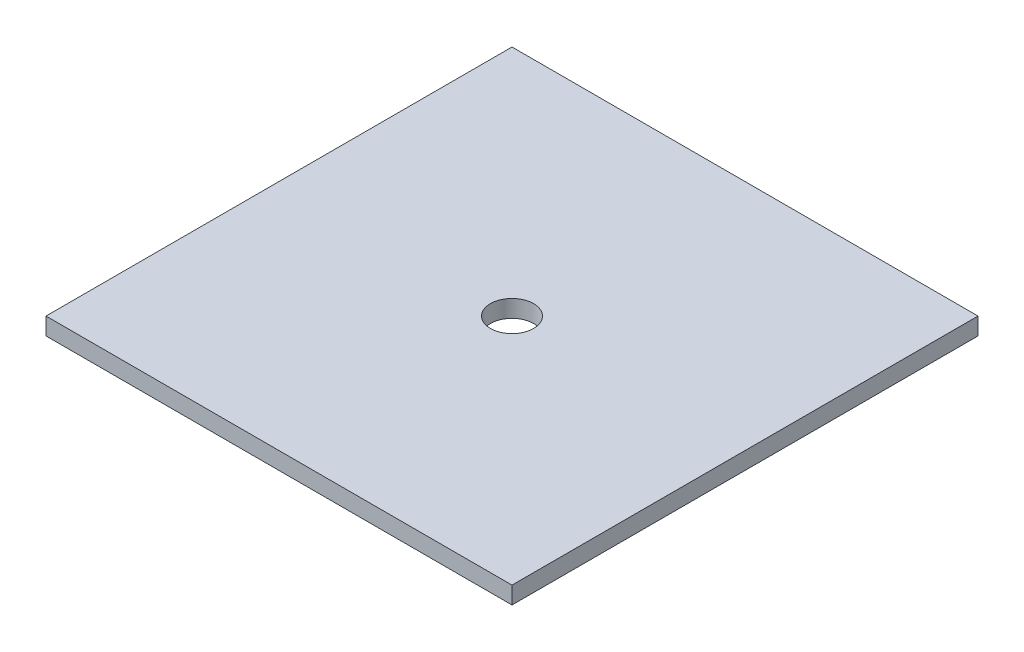
ISO-10303-21;
HEADER;
FILE_DESCRIPTION(('STEP AP214'),'2;1');
FILE_NAME('part.step','',(''),(''),'','','');
FILE_SCHEMA(('AUTOMOTIVE_DESIGN { 1 0 10303 214 1 1 1 1 }'));
ENDSEC;
DATA;
#1=APPLICATION_CONTEXT('core data for automotive mechanical design processes');
#2=APPLICATION_PROTOCOL_DEFINITION('international standard','automotive_design',2000,#1);
#3=PRODUCT_CONTEXT('',#1,'mechanical');
#4=PRODUCT('Part','Part','',(#3));
#5=PRODUCT_RELATED_PRODUCT_CATEGORY('part','',(#4));
#6=PRODUCT_DEFINITION_FORMATION('','',#4);
#7=PRODUCT_DEFINITION_CONTEXT('part definition',#1,'design');
#8=PRODUCT_DEFINITION('design','',#6,#7);
#9=PRODUCT_DEFINITION_SHAPE('','',#8);
#10=(LENGTH_UNIT() NAMED_UNIT(*) SI_UNIT(.MILLI.,.METRE.));
#11=(NAMED_UNIT(*) PLANE_ANGLE_UNIT() SI_UNIT($,.RADIAN.));
#12=(NAMED_UNIT(*) SI_UNIT($,.STERADIAN.) SOLID_ANGLE_UNIT());
#13=UNCERTAINTY_MEASURE_WITH_UNIT(LENGTH_MEASURE(1.E-05),#10,'distance_accuracy_value','');
#14=(GEOMETRIC_REPRESENTATION_CONTEXT(3) GLOBAL_UNCERTAINTY_ASSIGNED_CONTEXT((#13)) GLOBAL_UNIT_ASSIGNED_CONTEXT((#10,
#11,#12)) REPRESENTATION_CONTEXT('',''));
#15=CARTESIAN_POINT('',(0.,0.,0.));
#16=DIRECTION('',(0.,0.,1.));
#17=DIRECTION('',(1.,0.,0.));
#18=AXIS2_PLACEMENT_3D('',#15,#16,#17);
#19=CARTESIAN_POINT('',(-87.,6.,87.));
#20=DIRECTION('',(1.,0.,0.));
#21=DIRECTION('',(0.,0.,-1.));
#22=AXIS2_PLACEMENT_3D('',#19,#20,#21);
#23=PLANE('',#22);
#24=DIRECTION('',(0.,0.,1.));
#25=VECTOR('',#24,1.);
#26=CARTESIAN_POINT('',(-87.,0.,87.));
#27=LINE('',#26,#25);
#28=CARTESIAN_POINT('',(-87.,0.,-75.));
#29=VERTEX_POINT('',#28);
#30=CARTESIAN_POINT('',(-87.,0.,87.));
#31=VERTEX_POINT('',#30);
#32=EDGE_CURVE('E107',#29,#31,#27,.T.);
#33=ORIENTED_EDGE('',*,*,#32,.T.);
#34=DIRECTION('',(0.,-1.,0.));
#35=VECTOR('',#34,1.);
#36=CARTESIAN_POINT('',(-87.,6.,87.));
#37=LINE('',#36,#35);
#38=CARTESIAN_POINT('',(-87.,6.,87.));
#39=VERTEX_POINT('',#38);
#40=EDGE_CURVE('E11',#39,#31,#37,.T.);
#41=ORIENTED_EDGE('',*,*,#40,.F.);
#42=DIRECTION('',(0.,0.,1.));
#43=VECTOR('',#42,1.);
#44=CARTESIAN_POINT('',(-87.,6.,87.));
#45=LINE('',#44,#43);
#46=CARTESIAN_POINT('',(-87.,6.,-75.));
#47=VERTEX_POINT('',#46);
#48=EDGE_CURVE('E91',#47,#39,#45,.T.);
#49=ORIENTED_EDGE('',*,*,#48,.F.);
#50=DIRECTION('',(0.,-1.,0.));
#51=VECTOR('',#50,1.);
#52=CARTESIAN_POINT('',(-87.,6.,-75.));
#53=LINE('',#52,#51);
#54=EDGE_CURVE('E103',#47,#29,#53,.T.);
#55=ORIENTED_EDGE('',*,*,#54,.T.);
#56=EDGE_LOOP('',(#33,#41,#49,#55));
#57=FACE_BOUND('',#56,.T.);
#58=ADVANCED_FACE('F39',(#57),#23,.F.);
#59=CARTESIAN_POINT('',(75.,6.,87.));
#60=DIRECTION('',(0.,0.,-1.));
#61=DIRECTION('',(-1.,0.,0.));
#62=AXIS2_PLACEMENT_3D('',#59,#60,#61);
#63=PLANE('',#62);
#64=DIRECTION('',(1.,0.,0.));
#65=VECTOR('',#64,1.);
#66=CARTESIAN_POINT('',(75.,0.,87.));
#67=LINE('',#66,#65);
#68=CARTESIAN_POINT('',(75.,0.,87.));
#69=VERTEX_POINT('',#68);
#70=EDGE_CURVE('E96',#31,#69,#67,.T.);
#71=ORIENTED_EDGE('',*,*,#70,.T.);
#72=DIRECTION('',(0.,-1.,0.));
#73=VECTOR('',#72,1.);
#74=CARTESIAN_POINT('',(75.,6.,87.));
#75=LINE('',#74,#73);
#76=CARTESIAN_POINT('',(75.,6.,87.));
#77=VERTEX_POINT('',#76);
#78=EDGE_CURVE('E48',#77,#69,#75,.T.);
#79=ORIENTED_EDGE('',*,*,#78,.F.);
#80=DIRECTION('',(1.,0.,0.));
#81=VECTOR('',#80,1.);
#82=CARTESIAN_POINT('',(75.,6.,87.));
#83=LINE('',#82,#81);
#84=EDGE_CURVE('E86',#39,#77,#83,.T.);
#85=ORIENTED_EDGE('',*,*,#84,.F.);
#86=ORIENTED_EDGE('',*,*,#40,.T.);
#87=EDGE_LOOP('',(#71,#79,#85,#86));
#88=FACE_BOUND('',#87,.T.);
#89=ADVANCED_FACE('F95',(#88),#63,.F.);
#90=CARTESIAN_POINT('',(75.,6.,87.));
#91=DIRECTION('',(-1.,0.,0.));
#92=DIRECTION('',(0.,0.,1.));
#93=AXIS2_PLACEMENT_3D('',#90,#91,#92);
#94=PLANE('',#93);
#95=DIRECTION('',(0.,0.,-1.));
#96=VECTOR('',#95,1.);
#97=CARTESIAN_POINT('',(75.,0.,87.));
#98=LINE('',#97,#96);
#99=CARTESIAN_POINT('',(75.,0.,-75.));
#100=VERTEX_POINT('',#99);
#101=EDGE_CURVE('E73',#69,#100,#98,.T.);
#102=ORIENTED_EDGE('',*,*,#101,.T.);
#103=DIRECTION('',(0.,-1.,0.));
#104=VECTOR('',#103,1.);
#105=CARTESIAN_POINT('',(75.,6.,-75.));
#106=LINE('',#105,#104);
#107=CARTESIAN_POINT('',(75.,6.,-75.));
#108=VERTEX_POINT('',#107);
#109=EDGE_CURVE('E98',#108,#100,#106,.T.);
#110=ORIENTED_EDGE('',*,*,#109,.F.);
#111=DIRECTION('',(0.,0.,-1.));
#112=VECTOR('',#111,1.);
#113=CARTESIAN_POINT('',(75.,6.,87.));
#114=LINE('',#113,#112);
#115=EDGE_CURVE('E89',#77,#108,#114,.T.);
#116=ORIENTED_EDGE('',*,*,#115,.F.);
#117=ORIENTED_EDGE('',*,*,#78,.T.);
#118=EDGE_LOOP('',(#102,#110,#116,#117));
#119=FACE_BOUND('',#118,.T.);
#120=ADVANCED_FACE('F99',(#119),#94,.F.);
#121=CARTESIAN_POINT('',(75.,6.,-75.));
#122=DIRECTION('',(0.,0.,1.));
#123=DIRECTION('',(1.,0.,0.));
#124=AXIS2_PLACEMENT_3D('',#121,#122,#123);
#125=PLANE('',#124);
#126=DIRECTION('',(-1.,0.,0.));
#127=VECTOR('',#126,1.);
#128=CARTESIAN_POINT('',(75.,0.,-75.));
#129=LINE('',#128,#127);
#130=EDGE_CURVE('E79',#100,#29,#129,.T.);
#131=ORIENTED_EDGE('',*,*,#130,.T.);
#132=ORIENTED_EDGE('',*,*,#54,.F.);
#133=DIRECTION('',(-1.,0.,0.));
#134=VECTOR('',#133,1.);
#135=CARTESIAN_POINT('',(75.,6.,-75.));
#136=LINE('',#135,#134);
#137=EDGE_CURVE('E56',#108,#47,#136,.T.);
#138=ORIENTED_EDGE('',*,*,#137,.F.);
#139=ORIENTED_EDGE('',*,*,#109,.T.);
#140=EDGE_LOOP('',(#131,#132,#138,#139));
#141=FACE_BOUND('',#140,.T.);
#142=ADVANCED_FACE('F121',(#141),#125,.F.);
#143=CARTESIAN_POINT('',(0.,6.,0.));
#144=DIRECTION('',(0.,1.,0.));
#145=DIRECTION('',(0.,0.,1.));
#146=AXIS2_PLACEMENT_3D('',#143,#144,#145);
#147=PLANE('',#146);
#148=CARTESIAN_POINT('',(-6.00000000000002,6.,6.00000000000002));
#149=DIRECTION('',(0.,1.,0.));
#150=DIRECTION('',(0.,0.,1.));
#151=AXIS2_PLACEMENT_3D('',#148,#149,#150);
#152=CIRCLE('',#151,7.5);
#153=CARTESIAN_POINT('',(-6.00000000000002,6.,13.5));
#154=VERTEX_POINT('',#153);
#155=EDGE_CURVE('E128',#154,#154,#152,.T.);
#156=ORIENTED_EDGE('',*,*,#155,.F.);
#157=EDGE_LOOP('',(#156));
#158=FACE_BOUND('',#157,.T.);
#159=ORIENTED_EDGE('',*,*,#48,.T.);
#160=ORIENTED_EDGE('',*,*,#84,.T.);
#161=ORIENTED_EDGE('',*,*,#115,.T.);
#162=ORIENTED_EDGE('',*,*,#137,.T.);
#163=EDGE_LOOP('',(#159,#160,#161,#162));
#164=FACE_BOUND('',#163,.T.);
#165=ADVANCED_FACE('F87',(#158,#164),#147,.T.);
#166=CARTESIAN_POINT('',(0.,0.,0.));
#167=DIRECTION('',(0.,1.,0.));
#168=DIRECTION('',(0.,0.,1.));
#169=AXIS2_PLACEMENT_3D('',#166,#167,#168);
#170=PLANE('',#169);
#171=CARTESIAN_POINT('',(-6.00000000000002,0.,6.00000000000002));
#172=DIRECTION('',(0.,1.,0.));
#173=DIRECTION('',(0.,0.,1.));
#174=AXIS2_PLACEMENT_3D('',#171,#172,#173);
#175=CIRCLE('',#174,7.5);
#176=CARTESIAN_POINT('',(-6.00000000000002,0.,13.5));
#177=VERTEX_POINT('',#176);
#178=EDGE_CURVE('E111',#177,#177,#175,.T.);
#179=ORIENTED_EDGE('',*,*,#178,.T.);
#180=EDGE_LOOP('',(#179));
#181=FACE_BOUND('',#180,.T.);
#182=ORIENTED_EDGE('',*,*,#32,.F.);
#183=ORIENTED_EDGE('',*,*,#130,.F.);
#184=ORIENTED_EDGE('',*,*,#101,.F.);
#185=ORIENTED_EDGE('',*,*,#70,.F.);
#186=EDGE_LOOP('',(#182,#183,#184,#185));
#187=FACE_BOUND('',#186,.T.);
#188=ADVANCED_FACE('F124',(#181,#187),#170,.F.);
#189=CARTESIAN_POINT('',(-6.00000000000002,0.,6.00000000000002));
#190=DIRECTION('',(0.,1.,0.));
#191=DIRECTION('',(0.,0.,1.));
#192=AXIS2_PLACEMENT_3D('',#189,#190,#191);
#193=CYLINDRICAL_SURFACE('',#192,7.5);
#194=ORIENTED_EDGE('',*,*,#178,.F.);
#195=EDGE_LOOP('',(#194));
#196=FACE_BOUND('',#195,.T.);
#197=ORIENTED_EDGE('',*,*,#155,.T.);
#198=EDGE_LOOP('',(#197));
#199=FACE_BOUND('',#198,.T.);
#200=ADVANCED_FACE('F137',(#196,#199),#193,.F.);
#201=CLOSED_SHELL('',(#58,#89,#120,#142,#165,#188,#200));
#202=MANIFOLD_SOLID_BREP('B2',#201);
#203=ADVANCED_BREP_SHAPE_REPRESENTATION('',(#18,#202),#14);
#204=SHAPE_DEFINITION_REPRESENTATION(#9,#203);
ENDSEC;
END-ISO-10303-21;
